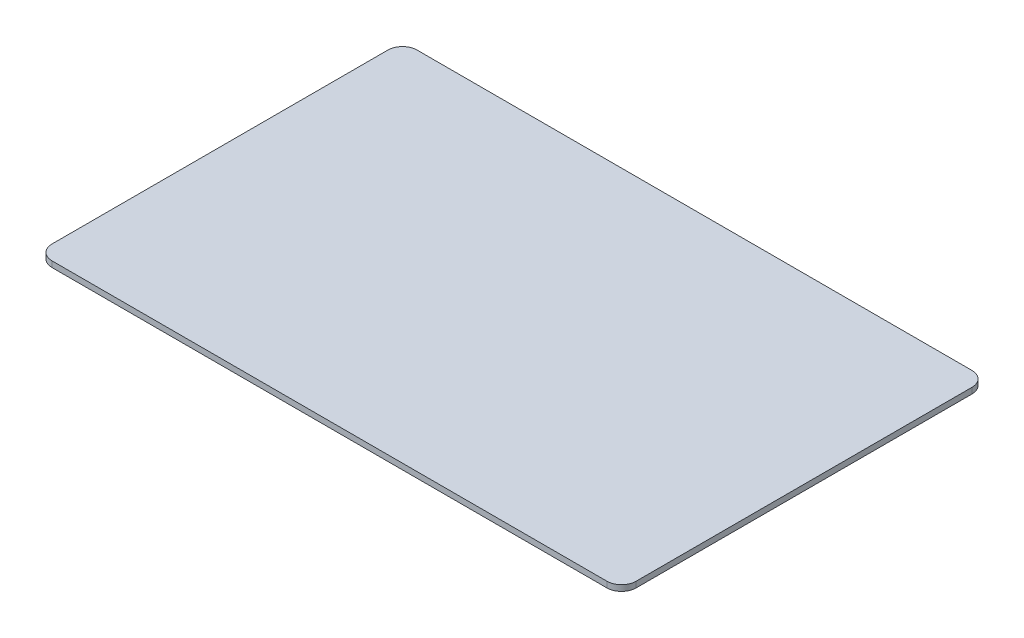
ISO-10303-21;
HEADER;
FILE_DESCRIPTION(('STEP AP214'),'2;1');
FILE_NAME('part.step','',(''),(''),'','','');
FILE_SCHEMA(('AUTOMOTIVE_DESIGN { 1 0 10303 214 1 1 1 1 }'));
ENDSEC;
DATA;
#1=APPLICATION_CONTEXT('core data for automotive mechanical design processes');
#2=APPLICATION_PROTOCOL_DEFINITION('international standard','automotive_design',2000,#1);
#3=PRODUCT_CONTEXT('',#1,'mechanical');
#4=PRODUCT('Part','Part','',(#3));
#5=PRODUCT_RELATED_PRODUCT_CATEGORY('part','',(#4));
#6=PRODUCT_DEFINITION_FORMATION('','',#4);
#7=PRODUCT_DEFINITION_CONTEXT('part definition',#1,'design');
#8=PRODUCT_DEFINITION('design','',#6,#7);
#9=PRODUCT_DEFINITION_SHAPE('','',#8);
#10=(LENGTH_UNIT() NAMED_UNIT(*) SI_UNIT(.MILLI.,.METRE.));
#11=(NAMED_UNIT(*) PLANE_ANGLE_UNIT() SI_UNIT($,.RADIAN.));
#12=(NAMED_UNIT(*) SI_UNIT($,.STERADIAN.) SOLID_ANGLE_UNIT());
#13=UNCERTAINTY_MEASURE_WITH_UNIT(LENGTH_MEASURE(1.E-05),#10,'distance_accuracy_value','');
#14=(GEOMETRIC_REPRESENTATION_CONTEXT(3) GLOBAL_UNCERTAINTY_ASSIGNED_CONTEXT((#13)) GLOBAL_UNIT_ASSIGNED_CONTEXT((#10,
#11,#12)) REPRESENTATION_CONTEXT('',''));
#15=CARTESIAN_POINT('',(0.,0.,0.));
#16=DIRECTION('',(0.,0.,1.));
#17=DIRECTION('',(1.,0.,0.));
#18=AXIS2_PLACEMENT_3D('',#15,#16,#17);
#19=CARTESIAN_POINT('',(156.,1.6,-96.));
#20=DIRECTION('',(0.,-1.,0.));
#21=DIRECTION('',(0.,0.,-1.));
#22=AXIS2_PLACEMENT_3D('',#19,#20,#21);
#23=CYLINDRICAL_SURFACE('',#22,4.);
#24=CARTESIAN_POINT('',(156.,0.,-96.));
#25=DIRECTION('',(0.,1.,0.));
#26=DIRECTION('',(0.,0.,-1.));
#27=AXIS2_PLACEMENT_3D('',#24,#25,#26);
#28=CIRCLE('',#27,4.);
#29=CARTESIAN_POINT('',(160.,0.,-95.9999999999999));
#30=VERTEX_POINT('',#29);
#31=CARTESIAN_POINT('',(156.,0.,-100.));
#32=VERTEX_POINT('',#31);
#33=EDGE_CURVE('E129',#30,#32,#28,.T.);
#34=ORIENTED_EDGE('',*,*,#33,.T.);
#35=DIRECTION('',(0.,-1.,0.));
#36=VECTOR('',#35,1.);
#37=CARTESIAN_POINT('',(156.,1.6,-100.));
#38=LINE('',#37,#36);
#39=CARTESIAN_POINT('',(156.,1.6,-100.));
#40=VERTEX_POINT('',#39);
#41=EDGE_CURVE('E11',#40,#32,#38,.T.);
#42=ORIENTED_EDGE('',*,*,#41,.F.);
#43=CARTESIAN_POINT('',(156.,1.6,-96.));
#44=DIRECTION('',(0.,1.,0.));
#45=DIRECTION('',(0.,0.,-1.));
#46=AXIS2_PLACEMENT_3D('',#43,#44,#45);
#47=CIRCLE('',#46,4.);
#48=CARTESIAN_POINT('',(160.,1.6,-95.9999999999999));
#49=VERTEX_POINT('',#48);
#50=EDGE_CURVE('E143',#49,#40,#47,.T.);
#51=ORIENTED_EDGE('',*,*,#50,.F.);
#52=DIRECTION('',(0.,-1.,0.));
#53=VECTOR('',#52,1.);
#54=CARTESIAN_POINT('',(160.,1.6,-95.9999999999999));
#55=LINE('',#54,#53);
#56=EDGE_CURVE('E125',#49,#30,#55,.T.);
#57=ORIENTED_EDGE('',*,*,#56,.T.);
#58=EDGE_LOOP('',(#34,#42,#51,#57));
#59=FACE_BOUND('',#58,.T.);
#60=ADVANCED_FACE('F33',(#59),#23,.T.);
#61=CARTESIAN_POINT('',(4.00000000000003,1.6,-100.));
#62=DIRECTION('',(0.,0.,1.));
#63=DIRECTION('',(1.,0.,0.));
#64=AXIS2_PLACEMENT_3D('',#61,#62,#63);
#65=PLANE('',#64);
#66=DIRECTION('',(-1.,0.,0.));
#67=VECTOR('',#66,1.);
#68=CARTESIAN_POINT('',(4.00000000000003,0.,-100.));
#69=LINE('',#68,#67);
#70=CARTESIAN_POINT('',(4.00000000000003,0.,-100.));
#71=VERTEX_POINT('',#70);
#72=EDGE_CURVE('E132',#32,#71,#69,.T.);
#73=ORIENTED_EDGE('',*,*,#72,.T.);
#74=DIRECTION('',(0.,-1.,0.));
#75=VECTOR('',#74,1.);
#76=CARTESIAN_POINT('',(4.00000000000003,1.6,-100.));
#77=LINE('',#76,#75);
#78=CARTESIAN_POINT('',(4.00000000000003,1.6,-100.));
#79=VERTEX_POINT('',#78);
#80=EDGE_CURVE('E41',#79,#71,#77,.T.);
#81=ORIENTED_EDGE('',*,*,#80,.F.);
#82=DIRECTION('',(-1.,0.,0.));
#83=VECTOR('',#82,1.);
#84=CARTESIAN_POINT('',(4.00000000000003,1.6,-100.));
#85=LINE('',#84,#83);
#86=EDGE_CURVE('E92',#40,#79,#85,.T.);
#87=ORIENTED_EDGE('',*,*,#86,.F.);
#88=ORIENTED_EDGE('',*,*,#41,.T.);
#89=EDGE_LOOP('',(#73,#81,#87,#88));
#90=FACE_BOUND('',#89,.T.);
#91=ADVANCED_FACE('F178',(#90),#65,.F.);
#92=CARTESIAN_POINT('',(4.,1.6,-96.));
#93=DIRECTION('',(0.,-1.,0.));
#94=DIRECTION('',(0.,0.,-1.));
#95=AXIS2_PLACEMENT_3D('',#92,#93,#94);
#96=CYLINDRICAL_SURFACE('',#95,4.);
#97=CARTESIAN_POINT('',(4.,0.,-96.));
#98=DIRECTION('',(0.,1.,0.));
#99=DIRECTION('',(0.,0.,-1.));
#100=AXIS2_PLACEMENT_3D('',#97,#98,#99);
#101=CIRCLE('',#100,4.);
#102=CARTESIAN_POINT('',(0.,0.,-95.9999999999999));
#103=VERTEX_POINT('',#102);
#104=EDGE_CURVE('E134',#71,#103,#101,.T.);
#105=ORIENTED_EDGE('',*,*,#104,.T.);
#106=DIRECTION('',(0.,-1.,0.));
#107=VECTOR('',#106,1.);
#108=CARTESIAN_POINT('',(0.,1.6,-95.9999999999999));
#109=LINE('',#108,#107);
#110=CARTESIAN_POINT('',(0.,1.6,-95.9999999999999));
#111=VERTEX_POINT('',#110);
#112=EDGE_CURVE('E150',#111,#103,#109,.T.);
#113=ORIENTED_EDGE('',*,*,#112,.F.);
#114=CARTESIAN_POINT('',(4.,1.6,-96.));
#115=DIRECTION('',(0.,1.,0.));
#116=DIRECTION('',(0.,0.,-1.));
#117=AXIS2_PLACEMENT_3D('',#114,#115,#116);
#118=CIRCLE('',#117,4.);
#119=EDGE_CURVE('E158',#79,#111,#118,.T.);
#120=ORIENTED_EDGE('',*,*,#119,.F.);
#121=ORIENTED_EDGE('',*,*,#80,.T.);
#122=EDGE_LOOP('',(#105,#113,#120,#121));
#123=FACE_BOUND('',#122,.T.);
#124=ADVANCED_FACE('F156',(#123),#96,.T.);
#125=CARTESIAN_POINT('',(0.,1.6,-4.00000000000003));
#126=DIRECTION('',(1.,0.,0.));
#127=DIRECTION('',(0.,0.,-1.));
#128=AXIS2_PLACEMENT_3D('',#125,#126,#127);
#129=PLANE('',#128);
#130=DIRECTION('',(0.,0.,1.));
#131=VECTOR('',#130,1.);
#132=CARTESIAN_POINT('',(0.,0.,-4.00000000000003));
#133=LINE('',#132,#131);
#134=CARTESIAN_POINT('',(0.,0.,-4.00000000000003));
#135=VERTEX_POINT('',#134);
#136=EDGE_CURVE('E136',#103,#135,#133,.T.);
#137=ORIENTED_EDGE('',*,*,#136,.T.);
#138=DIRECTION('',(0.,-1.,0.));
#139=VECTOR('',#138,1.);
#140=CARTESIAN_POINT('',(0.,1.6,-4.00000000000003));
#141=LINE('',#140,#139);
#142=CARTESIAN_POINT('',(0.,1.6,-4.00000000000003));
#143=VERTEX_POINT('',#142);
#144=EDGE_CURVE('E147',#143,#135,#141,.T.);
#145=ORIENTED_EDGE('',*,*,#144,.F.);
#146=DIRECTION('',(0.,0.,1.));
#147=VECTOR('',#146,1.);
#148=CARTESIAN_POINT('',(0.,1.6,-4.00000000000003));
#149=LINE('',#148,#147);
#150=EDGE_CURVE('E170',#111,#143,#149,.T.);
#151=ORIENTED_EDGE('',*,*,#150,.F.);
#152=ORIENTED_EDGE('',*,*,#112,.T.);
#153=EDGE_LOOP('',(#137,#145,#151,#152));
#154=FACE_BOUND('',#153,.T.);
#155=ADVANCED_FACE('F166',(#154),#129,.F.);
#156=CARTESIAN_POINT('',(4.,1.6,-4.));
#157=DIRECTION('',(0.,-1.,0.));
#158=DIRECTION('',(0.,0.,-1.));
#159=AXIS2_PLACEMENT_3D('',#156,#157,#158);
#160=CYLINDRICAL_SURFACE('',#159,4.);
#161=CARTESIAN_POINT('',(4.,0.,-4.));
#162=DIRECTION('',(0.,1.,0.));
#163=DIRECTION('',(0.,0.,-1.));
#164=AXIS2_PLACEMENT_3D('',#161,#162,#163);
#165=CIRCLE('',#164,4.);
#166=CARTESIAN_POINT('',(4.00000000000003,0.,0.));
#167=VERTEX_POINT('',#166);
#168=EDGE_CURVE('E138',#135,#167,#165,.T.);
#169=ORIENTED_EDGE('',*,*,#168,.T.);
#170=DIRECTION('',(0.,-1.,0.));
#171=VECTOR('',#170,1.);
#172=CARTESIAN_POINT('',(4.00000000000003,1.6,0.));
#173=LINE('',#172,#171);
#174=CARTESIAN_POINT('',(4.00000000000003,1.6,0.));
#175=VERTEX_POINT('',#174);
#176=EDGE_CURVE('E120',#175,#167,#173,.T.);
#177=ORIENTED_EDGE('',*,*,#176,.F.);
#178=CARTESIAN_POINT('',(4.,1.6,-4.));
#179=DIRECTION('',(0.,1.,0.));
#180=DIRECTION('',(0.,0.,-1.));
#181=AXIS2_PLACEMENT_3D('',#178,#179,#180);
#182=CIRCLE('',#181,4.);
#183=EDGE_CURVE('E111',#143,#175,#182,.T.);
#184=ORIENTED_EDGE('',*,*,#183,.F.);
#185=ORIENTED_EDGE('',*,*,#144,.T.);
#186=EDGE_LOOP('',(#169,#177,#184,#185));
#187=FACE_BOUND('',#186,.T.);
#188=ADVANCED_FACE('F169',(#187),#160,.T.);
#189=CARTESIAN_POINT('',(4.00000000000003,1.6,0.));
#190=DIRECTION('',(0.,0.,-1.));
#191=DIRECTION('',(-1.,0.,0.));
#192=AXIS2_PLACEMENT_3D('',#189,#190,#191);
#193=PLANE('',#192);
#194=DIRECTION('',(1.,0.,0.));
#195=VECTOR('',#194,1.);
#196=CARTESIAN_POINT('',(4.00000000000003,0.,0.));
#197=LINE('',#196,#195);
#198=CARTESIAN_POINT('',(156.,0.,0.));
#199=VERTEX_POINT('',#198);
#200=EDGE_CURVE('E119',#167,#199,#197,.T.);
#201=ORIENTED_EDGE('',*,*,#200,.T.);
#202=DIRECTION('',(0.,-1.,0.));
#203=VECTOR('',#202,1.);
#204=CARTESIAN_POINT('',(156.,1.6,0.));
#205=LINE('',#204,#203);
#206=CARTESIAN_POINT('',(156.,1.6,0.));
#207=VERTEX_POINT('',#206);
#208=EDGE_CURVE('E116',#207,#199,#205,.T.);
#209=ORIENTED_EDGE('',*,*,#208,.F.);
#210=DIRECTION('',(1.,0.,0.));
#211=VECTOR('',#210,1.);
#212=CARTESIAN_POINT('',(4.00000000000003,1.6,0.));
#213=LINE('',#212,#211);
#214=EDGE_CURVE('E105',#175,#207,#213,.T.);
#215=ORIENTED_EDGE('',*,*,#214,.F.);
#216=ORIENTED_EDGE('',*,*,#176,.T.);
#217=EDGE_LOOP('',(#201,#209,#215,#216));
#218=FACE_BOUND('',#217,.T.);
#219=ADVANCED_FACE('F117',(#218),#193,.F.);
#220=CARTESIAN_POINT('',(156.,1.6,-4.));
#221=DIRECTION('',(0.,-1.,0.));
#222=DIRECTION('',(0.,0.,-1.));
#223=AXIS2_PLACEMENT_3D('',#220,#221,#222);
#224=CYLINDRICAL_SURFACE('',#223,4.);
#225=CARTESIAN_POINT('',(156.,0.,-4.));
#226=DIRECTION('',(0.,1.,0.));
#227=DIRECTION('',(0.,0.,1.));
#228=AXIS2_PLACEMENT_3D('',#225,#226,#227);
#229=CIRCLE('',#228,4.);
#230=CARTESIAN_POINT('',(160.,0.,-4.00000000000002));
#231=VERTEX_POINT('',#230);
#232=EDGE_CURVE('E78',#199,#231,#229,.T.);
#233=ORIENTED_EDGE('',*,*,#232,.T.);
#234=DIRECTION('',(0.,-1.,0.));
#235=VECTOR('',#234,1.);
#236=CARTESIAN_POINT('',(160.,1.6,-4.00000000000002));
#237=LINE('',#236,#235);
#238=CARTESIAN_POINT('',(160.,1.6,-4.00000000000002));
#239=VERTEX_POINT('',#238);
#240=EDGE_CURVE('E121',#239,#231,#237,.T.);
#241=ORIENTED_EDGE('',*,*,#240,.F.);
#242=CARTESIAN_POINT('',(156.,1.6,-4.));
#243=DIRECTION('',(0.,1.,0.));
#244=DIRECTION('',(0.,0.,1.));
#245=AXIS2_PLACEMENT_3D('',#242,#243,#244);
#246=CIRCLE('',#245,4.);
#247=EDGE_CURVE('E109',#207,#239,#246,.T.);
#248=ORIENTED_EDGE('',*,*,#247,.F.);
#249=ORIENTED_EDGE('',*,*,#208,.T.);
#250=EDGE_LOOP('',(#233,#241,#248,#249));
#251=FACE_BOUND('',#250,.T.);
#252=ADVANCED_FACE('F123',(#251),#224,.T.);
#253=CARTESIAN_POINT('',(160.,1.6,-4.00000000000002));
#254=DIRECTION('',(-1.,0.,0.));
#255=DIRECTION('',(0.,0.,1.));
#256=AXIS2_PLACEMENT_3D('',#253,#254,#255);
#257=PLANE('',#256);
#258=DIRECTION('',(0.,0.,-1.));
#259=VECTOR('',#258,1.);
#260=CARTESIAN_POINT('',(160.,0.,-4.00000000000002));
#261=LINE('',#260,#259);
#262=EDGE_CURVE('E84',#231,#30,#261,.T.);
#263=ORIENTED_EDGE('',*,*,#262,.T.);
#264=ORIENTED_EDGE('',*,*,#56,.F.);
#265=DIRECTION('',(0.,0.,-1.));
#266=VECTOR('',#265,1.);
#267=CARTESIAN_POINT('',(160.,1.6,-4.00000000000002));
#268=LINE('',#267,#266);
#269=EDGE_CURVE('E49',#239,#49,#268,.T.);
#270=ORIENTED_EDGE('',*,*,#269,.F.);
#271=ORIENTED_EDGE('',*,*,#240,.T.);
#272=EDGE_LOOP('',(#263,#264,#270,#271));
#273=FACE_BOUND('',#272,.T.);
#274=ADVANCED_FACE('F194',(#273),#257,.F.);
#275=CARTESIAN_POINT('',(156.,1.6,-96.));
#276=DIRECTION('',(0.,-1.,0.));
#277=DIRECTION('',(0.,0.,-1.));
#278=AXIS2_PLACEMENT_3D('',#275,#276,#277);
#279=PLANE('',#278);
#280=ORIENTED_EDGE('',*,*,#50,.T.);
#281=ORIENTED_EDGE('',*,*,#86,.T.);
#282=ORIENTED_EDGE('',*,*,#119,.T.);
#283=ORIENTED_EDGE('',*,*,#150,.T.);
#284=ORIENTED_EDGE('',*,*,#183,.T.);
#285=ORIENTED_EDGE('',*,*,#214,.T.);
#286=ORIENTED_EDGE('',*,*,#247,.T.);
#287=ORIENTED_EDGE('',*,*,#269,.T.);
#288=EDGE_LOOP('',(#280,#281,#282,#283,#284,#285,#286,#287));
#289=FACE_BOUND('',#288,.T.);
#290=ADVANCED_FACE('F107',(#289),#279,.F.);
#291=CARTESIAN_POINT('',(156.,0.,-96.));
#292=DIRECTION('',(0.,-1.,0.));
#293=DIRECTION('',(0.,0.,-1.));
#294=AXIS2_PLACEMENT_3D('',#291,#292,#293);
#295=PLANE('',#294);
#296=ORIENTED_EDGE('',*,*,#33,.F.);
#297=ORIENTED_EDGE('',*,*,#262,.F.);
#298=ORIENTED_EDGE('',*,*,#232,.F.);
#299=ORIENTED_EDGE('',*,*,#200,.F.);
#300=ORIENTED_EDGE('',*,*,#168,.F.);
#301=ORIENTED_EDGE('',*,*,#136,.F.);
#302=ORIENTED_EDGE('',*,*,#104,.F.);
#303=ORIENTED_EDGE('',*,*,#72,.F.);
#304=EDGE_LOOP('',(#296,#297,#298,#299,#300,#301,#302,#303));
#305=FACE_BOUND('',#304,.T.);
#306=ADVANCED_FACE('F162',(#305),#295,.T.);
#307=CLOSED_SHELL('',(#60,#91,#124,#155,#188,#219,#252,#274,#290,#306));
#308=MANIFOLD_SOLID_BREP('B2',#307);
#309=ADVANCED_BREP_SHAPE_REPRESENTATION('',(#18,#308),#14);
#310=SHAPE_DEFINITION_REPRESENTATION(#9,#309);
ENDSEC;
END-ISO-10303-21;
